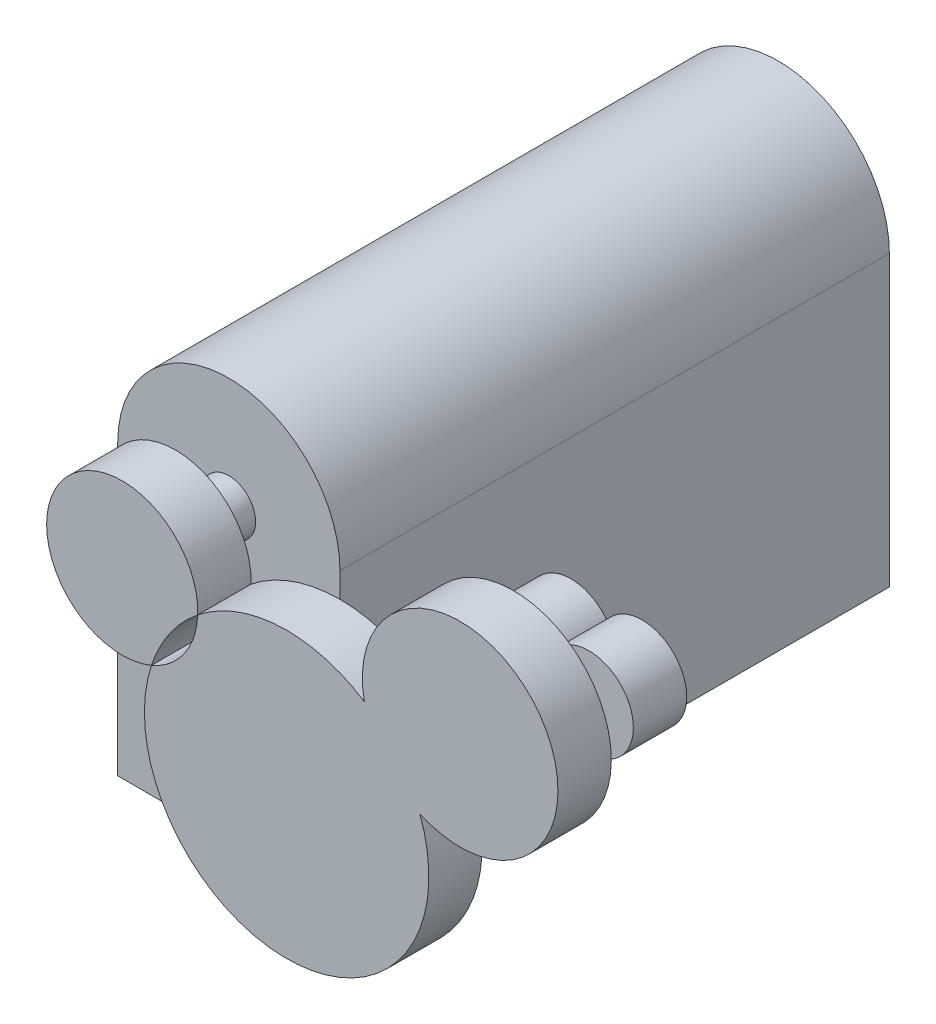
ISO-10303-21;
HEADER;
FILE_DESCRIPTION(('STEP AP214'),'2;1');
FILE_NAME('part.step','',(''),(''),'','','');
FILE_SCHEMA(('AUTOMOTIVE_DESIGN { 1 0 10303 214 1 1 1 1 }'));
ENDSEC;
DATA;
#1=APPLICATION_CONTEXT('core data for automotive mechanical design processes');
#2=APPLICATION_PROTOCOL_DEFINITION('international standard','automotive_design',2000,#1);
#3=PRODUCT_CONTEXT('',#1,'mechanical');
#4=PRODUCT('Part','Part','',(#3));
#5=PRODUCT_RELATED_PRODUCT_CATEGORY('part','',(#4));
#6=PRODUCT_DEFINITION_FORMATION('','',#4);
#7=PRODUCT_DEFINITION_CONTEXT('part definition',#1,'design');
#8=PRODUCT_DEFINITION('design','',#6,#7);
#9=PRODUCT_DEFINITION_SHAPE('','',#8);
#10=(LENGTH_UNIT() NAMED_UNIT(*) SI_UNIT(.MILLI.,.METRE.));
#11=(NAMED_UNIT(*) PLANE_ANGLE_UNIT() SI_UNIT($,.RADIAN.));
#12=(NAMED_UNIT(*) SI_UNIT($,.STERADIAN.) SOLID_ANGLE_UNIT());
#13=UNCERTAINTY_MEASURE_WITH_UNIT(LENGTH_MEASURE(1.E-05),#10,'distance_accuracy_value','');
#14=(GEOMETRIC_REPRESENTATION_CONTEXT(3) GLOBAL_UNCERTAINTY_ASSIGNED_CONTEXT((#13)) GLOBAL_UNIT_ASSIGNED_CONTEXT((#10,
#11,#12)) REPRESENTATION_CONTEXT('',''));
#15=CARTESIAN_POINT('',(0.,0.,0.));
#16=DIRECTION('',(0.,0.,1.));
#17=DIRECTION('',(1.,0.,0.));
#18=AXIS2_PLACEMENT_3D('',#15,#16,#17);
#19=CARTESIAN_POINT('',(9.25,-6.40312423743285,-8.77304960115332));
#20=DIRECTION('',(0.,0.,1.));
#21=DIRECTION('',(1.,0.,0.));
#22=AXIS2_PLACEMENT_3D('',#19,#20,#21);
#23=CYLINDRICAL_SURFACE('',#22,1.);
#24=CARTESIAN_POINT('',(9.25,-6.40312423743285,3.));
#25=DIRECTION('',(0.,0.,1.));
#26=DIRECTION('',(1.,0.,0.));
#27=AXIS2_PLACEMENT_3D('',#24,#25,#26);
#28=CIRCLE('',#27,1.);
#29=CARTESIAN_POINT('',(10.25,-6.40312423743285,3.));
#30=VERTEX_POINT('',#29);
#31=EDGE_CURVE('E100',#30,#30,#28,.F.);
#32=ORIENTED_EDGE('',*,*,#31,.T.);
#33=EDGE_LOOP('',(#32));
#34=FACE_BOUND('',#33,.T.);
#35=CARTESIAN_POINT('',(9.25,-6.40312423743285,-7.));
#36=DIRECTION('',(0.,0.,-1.));
#37=DIRECTION('',(-1.,0.,0.));
#38=AXIS2_PLACEMENT_3D('',#35,#36,#37);
#39=CIRCLE('',#38,1.);
#40=CARTESIAN_POINT('',(8.25,-6.40312423743285,-7.));
#41=VERTEX_POINT('',#40);
#42=EDGE_CURVE('E13',#41,#41,#39,.T.);
#43=ORIENTED_EDGE('',*,*,#42,.F.);
#44=EDGE_LOOP('',(#43));
#45=FACE_BOUND('',#44,.T.);
#46=ADVANCED_FACE('F92',(#34,#45),#23,.T.);
#47=CARTESIAN_POINT('',(9.25,-6.40312423743285,6.));
#48=DIRECTION('',(0.,0.,-1.));
#49=DIRECTION('',(-1.,0.,0.));
#50=AXIS2_PLACEMENT_3D('',#47,#48,#49);
#51=CYLINDRICAL_SURFACE('',#50,8.);
#52=CARTESIAN_POINT('',(9.25,-6.40312423743285,3.));
#53=DIRECTION('',(0.,0.,1.));
#54=DIRECTION('',(1.,0.,0.));
#55=AXIS2_PLACEMENT_3D('',#52,#53,#54);
#56=CIRCLE('',#55,8.);
#57=CARTESIAN_POINT('',(13.6232148532195,0.295755657563046,3.));
#58=VERTEX_POINT('',#57);
#59=CARTESIAN_POINT('',(4.24696616697173,-0.160556459220539,3.));
#60=VERTEX_POINT('',#59);
#61=EDGE_CURVE('E179',#58,#60,#56,.T.);
#62=ORIENTED_EDGE('',*,*,#61,.T.);
#63=DIRECTION('',(0.,0.,-1.));
#64=VECTOR('',#63,1.);
#65=CARTESIAN_POINT('',(4.24696616697173,-0.160556459220539,6.));
#66=LINE('',#65,#64);
#67=CARTESIAN_POINT('',(4.24696616697173,-0.160556459220539,6.));
#68=VERTEX_POINT('',#67);
#69=EDGE_CURVE('E188',#68,#60,#66,.T.);
#70=ORIENTED_EDGE('',*,*,#69,.F.);
#71=CARTESIAN_POINT('',(9.25,-6.40312423743285,6.));
#72=DIRECTION('',(0.,0.,1.));
#73=DIRECTION('',(1.,0.,0.));
#74=AXIS2_PLACEMENT_3D('',#71,#72,#73);
#75=CIRCLE('',#74,8.);
#76=CARTESIAN_POINT('',(13.6232148532195,0.295755657563046,6.));
#77=VERTEX_POINT('',#76);
#78=EDGE_CURVE('E172',#77,#68,#75,.T.);
#79=ORIENTED_EDGE('',*,*,#78,.F.);
#80=DIRECTION('',(0.,0.,-1.));
#81=VECTOR('',#80,1.);
#82=CARTESIAN_POINT('',(13.6232148532195,0.295755657563046,6.));
#83=LINE('',#82,#81);
#84=EDGE_CURVE('E184',#77,#58,#83,.T.);
#85=ORIENTED_EDGE('',*,*,#84,.T.);
#86=EDGE_LOOP('',(#62,#70,#79,#85));
#87=FACE_BOUND('',#86,.T.);
#88=ADVANCED_FACE('F206',(#87),#51,.T.);
#89=CARTESIAN_POINT('',(0.,0.,6.));
#90=DIRECTION('',(0.,0.,-1.));
#91=DIRECTION('',(-1.,0.,0.));
#92=AXIS2_PLACEMENT_3D('',#89,#90,#91);
#93=CYLINDRICAL_SURFACE('',#92,4.25);
#94=CARTESIAN_POINT('',(0.,0.,3.));
#95=DIRECTION('',(0.,0.,1.));
#96=DIRECTION('',(1.,0.,0.));
#97=AXIS2_PLACEMENT_3D('',#94,#95,#96);
#98=CIRCLE('',#97,4.25);
#99=CARTESIAN_POINT('',(1.64562642562085,-3.91847083277372,3.));
#100=VERTEX_POINT('',#99);
#101=EDGE_CURVE('E107',#100,#60,#98,.T.);
#102=ORIENTED_EDGE('',*,*,#101,.F.);
#103=DIRECTION('',(0.,0.,-1.));
#104=VECTOR('',#103,1.);
#105=CARTESIAN_POINT('',(1.64562642562085,-3.91847083277372,6.));
#106=LINE('',#105,#104);
#107=CARTESIAN_POINT('',(1.64562642562085,-3.91847083277372,6.));
#108=VERTEX_POINT('',#107);
#109=EDGE_CURVE('E185',#108,#100,#106,.T.);
#110=ORIENTED_EDGE('',*,*,#109,.F.);
#111=CARTESIAN_POINT('',(0.,0.,6.));
#112=DIRECTION('',(0.,0.,1.));
#113=DIRECTION('',(1.,0.,0.));
#114=AXIS2_PLACEMENT_3D('',#111,#112,#113);
#115=CIRCLE('',#114,4.25);
#116=EDGE_CURVE('E175',#108,#68,#115,.T.);
#117=ORIENTED_EDGE('',*,*,#116,.T.);
#118=ORIENTED_EDGE('',*,*,#69,.T.);
#119=EDGE_LOOP('',(#102,#110,#117,#118));
#120=FACE_BOUND('',#119,.T.);
#121=ADVANCED_FACE('F208',(#120),#93,.F.);
#122=CARTESIAN_POINT('',(16.744714652739,-3.60504413242873,3.));
#123=VERTEX_POINT('',#122);
#124=EDGE_CURVE('E176',#100,#123,#56,.T.);
#125=ORIENTED_EDGE('',*,*,#124,.T.);
#126=DIRECTION('',(0.,0.,-1.));
#127=VECTOR('',#126,1.);
#128=CARTESIAN_POINT('',(16.744714652739,-3.60504413242873,6.));
#129=LINE('',#128,#127);
#130=CARTESIAN_POINT('',(16.744714652739,-3.60504413242873,6.));
#131=VERTEX_POINT('',#130);
#132=EDGE_CURVE('E182',#131,#123,#129,.T.);
#133=ORIENTED_EDGE('',*,*,#132,.F.);
#134=EDGE_CURVE('E177',#108,#131,#75,.T.);
#135=ORIENTED_EDGE('',*,*,#134,.F.);
#136=ORIENTED_EDGE('',*,*,#109,.T.);
#137=EDGE_LOOP('',(#125,#133,#135,#136));
#138=FACE_BOUND('',#137,.T.);
#139=ADVANCED_FACE('F200',(#138),#51,.T.);
#140=CARTESIAN_POINT('',(0.,0.,3.));
#141=DIRECTION('',(0.,0.,1.));
#142=DIRECTION('',(1.,0.,0.));
#143=AXIS2_PLACEMENT_3D('',#140,#141,#142);
#144=PLANE('',#143);
#145=ORIENTED_EDGE('',*,*,#31,.F.);
#146=EDGE_LOOP('',(#145));
#147=FACE_BOUND('',#146,.T.);
#148=ORIENTED_EDGE('',*,*,#61,.F.);
#149=CARTESIAN_POINT('',(19.009810448979,1.40687576256716,3.));
#150=DIRECTION('',(0.,0.,1.));
#151=DIRECTION('',(1.,0.,0.));
#152=AXIS2_PLACEMENT_3D('',#149,#150,#151);
#153=CIRCLE('',#152,5.5);
#154=EDGE_CURVE('E164',#123,#58,#153,.T.);
#155=ORIENTED_EDGE('',*,*,#154,.F.);
#156=ORIENTED_EDGE('',*,*,#124,.F.);
#157=ORIENTED_EDGE('',*,*,#101,.T.);
#158=EDGE_LOOP('',(#148,#155,#156,#157));
#159=FACE_BOUND('',#158,.T.);
#160=ADVANCED_FACE('F197',(#147,#159),#144,.F.);
#161=CARTESIAN_POINT('',(0.,0.,6.));
#162=DIRECTION('',(0.,0.,1.));
#163=DIRECTION('',(1.,0.,0.));
#164=AXIS2_PLACEMENT_3D('',#161,#162,#163);
#165=PLANE('',#164);
#166=ORIENTED_EDGE('',*,*,#134,.T.);
#167=CARTESIAN_POINT('',(19.009810448979,1.40687576256716,6.));
#168=DIRECTION('',(0.,0.,1.));
#169=DIRECTION('',(1.,0.,0.));
#170=AXIS2_PLACEMENT_3D('',#167,#168,#169);
#171=CIRCLE('',#170,5.5);
#172=EDGE_CURVE('E167',#131,#77,#171,.T.);
#173=ORIENTED_EDGE('',*,*,#172,.T.);
#174=ORIENTED_EDGE('',*,*,#78,.T.);
#175=ORIENTED_EDGE('',*,*,#116,.F.);
#176=EDGE_LOOP('',(#166,#173,#174,#175));
#177=FACE_BOUND('',#176,.T.);
#178=ADVANCED_FACE('F199',(#177),#165,.T.);
#179=CARTESIAN_POINT('',(19.009810448979,1.40687576256716,6.));
#180=DIRECTION('',(0.,0.,-1.));
#181=DIRECTION('',(-1.,0.,0.));
#182=AXIS2_PLACEMENT_3D('',#179,#180,#181);
#183=CYLINDRICAL_SURFACE('',#182,5.5);
#184=ORIENTED_EDGE('',*,*,#154,.T.);
#185=ORIENTED_EDGE('',*,*,#84,.F.);
#186=ORIENTED_EDGE('',*,*,#172,.F.);
#187=ORIENTED_EDGE('',*,*,#132,.T.);
#188=EDGE_LOOP('',(#184,#185,#186,#187));
#189=FACE_BOUND('',#188,.T.);
#190=ADVANCED_FACE('F94',(#189),#183,.T.);
#191=CARTESIAN_POINT('',(13.25,-6.40312423743285,-10.));
#192=DIRECTION('',(0.,0.,1.));
#193=DIRECTION('',(1.,0.,0.));
#194=AXIS2_PLACEMENT_3D('',#191,#192,#193);
#195=CYLINDRICAL_SURFACE('',#194,2.5);
#196=CARTESIAN_POINT('',(13.25,-6.40312423743285,-7.));
#197=DIRECTION('',(0.,0.,-1.));
#198=DIRECTION('',(-1.,0.,0.));
#199=AXIS2_PLACEMENT_3D('',#196,#197,#198);
#200=CIRCLE('',#199,2.5);
#201=CARTESIAN_POINT('',(11.25,-4.90312423743285,-7.));
#202=VERTEX_POINT('',#201);
#203=CARTESIAN_POINT('',(11.25,-7.90312423743284,-7.));
#204=VERTEX_POINT('',#203);
#205=EDGE_CURVE('E163',#202,#204,#200,.T.);
#206=ORIENTED_EDGE('',*,*,#205,.T.);
#207=DIRECTION('',(0.,0.,1.));
#208=VECTOR('',#207,1.);
#209=CARTESIAN_POINT('',(11.25,-7.90312423743284,-10.));
#210=LINE('',#209,#208);
#211=CARTESIAN_POINT('',(11.25,-7.90312423743284,-10.));
#212=VERTEX_POINT('',#211);
#213=EDGE_CURVE('E149',#212,#204,#210,.T.);
#214=ORIENTED_EDGE('',*,*,#213,.F.);
#215=CARTESIAN_POINT('',(13.25,-6.40312423743285,-10.));
#216=DIRECTION('',(0.,0.,-1.));
#217=DIRECTION('',(-1.,0.,0.));
#218=AXIS2_PLACEMENT_3D('',#215,#216,#217);
#219=CIRCLE('',#218,2.5);
#220=CARTESIAN_POINT('',(11.25,-4.90312423743285,-10.));
#221=VERTEX_POINT('',#220);
#222=EDGE_CURVE('E155',#221,#212,#219,.T.);
#223=ORIENTED_EDGE('',*,*,#222,.F.);
#224=DIRECTION('',(0.,0.,1.));
#225=VECTOR('',#224,1.);
#226=CARTESIAN_POINT('',(11.25,-4.90312423743285,-10.));
#227=LINE('',#226,#225);
#228=EDGE_CURVE('E152',#221,#202,#227,.T.);
#229=ORIENTED_EDGE('',*,*,#228,.T.);
#230=EDGE_LOOP('',(#206,#214,#223,#229));
#231=FACE_BOUND('',#230,.T.);
#232=ADVANCED_FACE('F161',(#231),#195,.T.);
#233=CARTESIAN_POINT('',(9.25,-6.40312423743285,-10.));
#234=DIRECTION('',(0.,0.,1.));
#235=DIRECTION('',(1.,0.,0.));
#236=AXIS2_PLACEMENT_3D('',#233,#234,#235);
#237=CYLINDRICAL_SURFACE('',#236,2.5);
#238=CARTESIAN_POINT('',(9.25,-6.40312423743285,-7.));
#239=DIRECTION('',(0.,0.,-1.));
#240=DIRECTION('',(-1.,0.,0.));
#241=AXIS2_PLACEMENT_3D('',#238,#239,#240);
#242=CIRCLE('',#241,2.5);
#243=EDGE_CURVE('E159',#204,#202,#242,.T.);
#244=ORIENTED_EDGE('',*,*,#243,.T.);
#245=ORIENTED_EDGE('',*,*,#228,.F.);
#246=CARTESIAN_POINT('',(9.25,-6.40312423743285,-10.));
#247=DIRECTION('',(0.,0.,-1.));
#248=DIRECTION('',(-1.,0.,0.));
#249=AXIS2_PLACEMENT_3D('',#246,#247,#248);
#250=CIRCLE('',#249,2.5);
#251=EDGE_CURVE('E145',#212,#221,#250,.T.);
#252=ORIENTED_EDGE('',*,*,#251,.F.);
#253=ORIENTED_EDGE('',*,*,#213,.T.);
#254=EDGE_LOOP('',(#244,#245,#252,#253));
#255=FACE_BOUND('',#254,.T.);
#256=ADVANCED_FACE('F147',(#255),#237,.T.);
#257=CARTESIAN_POINT('',(11.25,-6.40312423743285,-10.));
#258=DIRECTION('',(0.,0.,-1.));
#259=DIRECTION('',(-1.,0.,0.));
#260=AXIS2_PLACEMENT_3D('',#257,#258,#259);
#261=PLANE('',#260);
#262=ORIENTED_EDGE('',*,*,#222,.T.);
#263=ORIENTED_EDGE('',*,*,#251,.T.);
#264=EDGE_LOOP('',(#262,#263));
#265=FACE_BOUND('',#264,.T.);
#266=ADVANCED_FACE('F157',(#265),#261,.T.);
#267=CARTESIAN_POINT('',(11.25,-6.40312423743285,-7.));
#268=DIRECTION('',(0.,0.,-1.));
#269=DIRECTION('',(-1.,0.,0.));
#270=AXIS2_PLACEMENT_3D('',#267,#268,#269);
#271=PLANE('',#270);
#272=ORIENTED_EDGE('',*,*,#42,.T.);
#273=EDGE_LOOP('',(#272));
#274=FACE_BOUND('',#273,.T.);
#275=ORIENTED_EDGE('',*,*,#205,.F.);
#276=ORIENTED_EDGE('',*,*,#243,.F.);
#277=EDGE_LOOP('',(#275,#276));
#278=FACE_BOUND('',#277,.T.);
#279=ADVANCED_FACE('F269',(#274,#278),#271,.F.);
#280=CLOSED_SHELL('',(#46,#88,#121,#139,#160,#178,#190,#232,#256,#266,#279));
#281=MANIFOLD_SOLID_BREP('B2',#280);
#282=CARTESIAN_POINT('',(0.,0.,-30.9));
#283=DIRECTION('',(0.,0.,1.));
#284=DIRECTION('',(1.,0.,0.));
#285=AXIS2_PLACEMENT_3D('',#282,#283,#284);
#286=CYLINDRICAL_SURFACE('',#285,6.25);
#287=CARTESIAN_POINT('',(0.,0.,0.));
#288=DIRECTION('',(0.,0.,1.));
#289=DIRECTION('',(1.,0.,0.));
#290=AXIS2_PLACEMENT_3D('',#287,#288,#289);
#291=CIRCLE('',#290,6.25);
#292=CARTESIAN_POINT('',(6.25,0.,0.));
#293=VERTEX_POINT('',#292);
#294=CARTESIAN_POINT('',(-6.25,0.,0.));
#295=VERTEX_POINT('',#294);
#296=EDGE_CURVE('E408',#293,#295,#291,.T.);
#297=ORIENTED_EDGE('',*,*,#296,.F.);
#298=DIRECTION('',(0.,0.,1.));
#299=VECTOR('',#298,1.);
#300=CARTESIAN_POINT('',(6.25,0.,-30.9));
#301=LINE('',#300,#299);
#302=CARTESIAN_POINT('',(6.25,0.,-30.9));
#303=VERTEX_POINT('',#302);
#304=EDGE_CURVE('E90',#303,#293,#301,.T.);
#305=ORIENTED_EDGE('',*,*,#304,.F.);
#306=CARTESIAN_POINT('',(0.,0.,-30.9));
#307=DIRECTION('',(0.,0.,1.));
#308=DIRECTION('',(1.,0.,0.));
#309=AXIS2_PLACEMENT_3D('',#306,#307,#308);
#310=CIRCLE('',#309,6.25);
#311=CARTESIAN_POINT('',(-6.25,0.,-30.9));
#312=VERTEX_POINT('',#311);
#313=EDGE_CURVE('E412',#303,#312,#310,.T.);
#314=ORIENTED_EDGE('',*,*,#313,.T.);
#315=DIRECTION('',(0.,0.,1.));
#316=VECTOR('',#315,1.);
#317=CARTESIAN_POINT('',(-6.25,0.,-30.9));
#318=LINE('',#317,#316);
#319=EDGE_CURVE('E315',#312,#295,#318,.T.);
#320=ORIENTED_EDGE('',*,*,#319,.T.);
#321=EDGE_LOOP('',(#297,#305,#314,#320));
#322=FACE_BOUND('',#321,.T.);
#323=ADVANCED_FACE('F312',(#322),#286,.T.);
#324=CARTESIAN_POINT('',(6.25,-16.25,-30.9));
#325=DIRECTION('',(1.,0.,0.));
#326=DIRECTION('',(0.,0.,-1.));
#327=AXIS2_PLACEMENT_3D('',#324,#325,#326);
#328=PLANE('',#327);
#329=DIRECTION('',(0.,1.,0.));
#330=VECTOR('',#329,1.);
#331=CARTESIAN_POINT('',(6.25,-16.25,0.));
#332=LINE('',#331,#330);
#333=CARTESIAN_POINT('',(6.25,-16.25,0.));
#334=VERTEX_POINT('',#333);
#335=EDGE_CURVE('E416',#334,#293,#332,.T.);
#336=ORIENTED_EDGE('',*,*,#335,.F.);
#337=DIRECTION('',(0.,0.,1.));
#338=VECTOR('',#337,1.);
#339=CARTESIAN_POINT('',(6.25,-16.25,-30.9));
#340=LINE('',#339,#338);
#341=CARTESIAN_POINT('',(6.25,-16.25,-30.9));
#342=VERTEX_POINT('',#341);
#343=EDGE_CURVE('E322',#342,#334,#340,.T.);
#344=ORIENTED_EDGE('',*,*,#343,.F.);
#345=DIRECTION('',(0.,1.,0.));
#346=VECTOR('',#345,1.);
#347=CARTESIAN_POINT('',(6.25,-16.25,-30.9));
#348=LINE('',#347,#346);
#349=EDGE_CURVE('E422',#342,#303,#348,.T.);
#350=ORIENTED_EDGE('',*,*,#349,.T.);
#351=ORIENTED_EDGE('',*,*,#304,.T.);
#352=EDGE_LOOP('',(#336,#344,#350,#351));
#353=FACE_BOUND('',#352,.T.);
#354=ADVANCED_FACE('F445',(#353),#328,.T.);
#355=CARTESIAN_POINT('',(-6.25,-16.25,-30.9));
#356=DIRECTION('',(0.,-1.,0.));
#357=DIRECTION('',(0.,0.,-1.));
#358=AXIS2_PLACEMENT_3D('',#355,#356,#357);
#359=PLANE('',#358);
#360=DIRECTION('',(1.,0.,0.));
#361=VECTOR('',#360,1.);
#362=CARTESIAN_POINT('',(-6.25,-16.25,0.));
#363=LINE('',#362,#361);
#364=CARTESIAN_POINT('',(-6.25,-16.25,0.));
#365=VERTEX_POINT('',#364);
#366=EDGE_CURVE('E432',#365,#334,#363,.T.);
#367=ORIENTED_EDGE('',*,*,#366,.F.);
#368=DIRECTION('',(0.,0.,1.));
#369=VECTOR('',#368,1.);
#370=CARTESIAN_POINT('',(-6.25,-16.25,-30.9));
#371=LINE('',#370,#369);
#372=CARTESIAN_POINT('',(-6.25,-16.25,-30.9));
#373=VERTEX_POINT('',#372);
#374=EDGE_CURVE('E439',#373,#365,#371,.T.);
#375=ORIENTED_EDGE('',*,*,#374,.F.);
#376=DIRECTION('',(1.,0.,0.));
#377=VECTOR('',#376,1.);
#378=CARTESIAN_POINT('',(-6.25,-16.25,-30.9));
#379=LINE('',#378,#377);
#380=EDGE_CURVE('E419',#373,#342,#379,.T.);
#381=ORIENTED_EDGE('',*,*,#380,.T.);
#382=ORIENTED_EDGE('',*,*,#343,.T.);
#383=EDGE_LOOP('',(#367,#375,#381,#382));
#384=FACE_BOUND('',#383,.T.);
#385=ADVANCED_FACE('F448',(#384),#359,.T.);
#386=CARTESIAN_POINT('',(-6.25,0.,-30.9));
#387=DIRECTION('',(-1.,0.,0.));
#388=DIRECTION('',(0.,0.,1.));
#389=AXIS2_PLACEMENT_3D('',#386,#387,#388);
#390=PLANE('',#389);
#391=DIRECTION('',(0.,-1.,0.));
#392=VECTOR('',#391,1.);
#393=CARTESIAN_POINT('',(-6.25,0.,0.));
#394=LINE('',#393,#392);
#395=EDGE_CURVE('E428',#295,#365,#394,.T.);
#396=ORIENTED_EDGE('',*,*,#395,.F.);
#397=ORIENTED_EDGE('',*,*,#319,.F.);
#398=DIRECTION('',(0.,-1.,0.));
#399=VECTOR('',#398,1.);
#400=CARTESIAN_POINT('',(-6.25,0.,-30.9));
#401=LINE('',#400,#399);
#402=EDGE_CURVE('E415',#312,#373,#401,.T.);
#403=ORIENTED_EDGE('',*,*,#402,.T.);
#404=ORIENTED_EDGE('',*,*,#374,.T.);
#405=EDGE_LOOP('',(#396,#397,#403,#404));
#406=FACE_BOUND('',#405,.T.);
#407=ADVANCED_FACE('F442',(#406),#390,.T.);
#408=CARTESIAN_POINT('',(0.,0.,-30.9));
#409=DIRECTION('',(0.,0.,1.));
#410=DIRECTION('',(1.,0.,0.));
#411=AXIS2_PLACEMENT_3D('',#408,#409,#410);
#412=PLANE('',#411);
#413=ORIENTED_EDGE('',*,*,#313,.F.);
#414=ORIENTED_EDGE('',*,*,#349,.F.);
#415=ORIENTED_EDGE('',*,*,#380,.F.);
#416=ORIENTED_EDGE('',*,*,#402,.F.);
#417=EDGE_LOOP('',(#413,#414,#415,#416));
#418=FACE_BOUND('',#417,.T.);
#419=ADVANCED_FACE('F450',(#418),#412,.F.);
#420=CARTESIAN_POINT('',(0.,0.,0.));
#421=DIRECTION('',(0.,0.,1.));
#422=DIRECTION('',(1.,0.,0.));
#423=AXIS2_PLACEMENT_3D('',#420,#421,#422);
#424=PLANE('',#423);
#425=CARTESIAN_POINT('',(0.,0.,0.));
#426=DIRECTION('',(0.,0.,1.));
#427=DIRECTION('',(1.,0.,0.));
#428=AXIS2_PLACEMENT_3D('',#425,#426,#427);
#429=CIRCLE('',#428,1.5);
#430=CARTESIAN_POINT('',(1.5,0.,0.));
#431=VERTEX_POINT('',#430);
#432=EDGE_CURVE('E392',#431,#431,#429,.T.);
#433=ORIENTED_EDGE('',*,*,#432,.F.);
#434=EDGE_LOOP('',(#433));
#435=FACE_BOUND('',#434,.T.);
#436=ORIENTED_EDGE('',*,*,#296,.T.);
#437=ORIENTED_EDGE('',*,*,#395,.T.);
#438=ORIENTED_EDGE('',*,*,#366,.T.);
#439=ORIENTED_EDGE('',*,*,#335,.T.);
#440=EDGE_LOOP('',(#436,#437,#438,#439));
#441=FACE_BOUND('',#440,.T.);
#442=ADVANCED_FACE('F444',(#435,#441),#424,.T.);
#443=CARTESIAN_POINT('',(0.,0.,3.));
#444=DIRECTION('',(0.,0.,-1.));
#445=DIRECTION('',(-1.,0.,0.));
#446=AXIS2_PLACEMENT_3D('',#443,#444,#445);
#447=CYLINDRICAL_SURFACE('',#446,1.5);
#448=CARTESIAN_POINT('',(0.,0.,3.));
#449=DIRECTION('',(0.,0.,1.));
#450=DIRECTION('',(1.,0.,0.));
#451=AXIS2_PLACEMENT_3D('',#448,#449,#450);
#452=CIRCLE('',#451,1.5);
#453=CARTESIAN_POINT('',(1.5,0.,3.));
#454=VERTEX_POINT('',#453);
#455=EDGE_CURVE('E404',#454,#454,#452,.T.);
#456=ORIENTED_EDGE('',*,*,#455,.F.);
#457=EDGE_LOOP('',(#456));
#458=FACE_BOUND('',#457,.T.);
#459=ORIENTED_EDGE('',*,*,#432,.T.);
#460=EDGE_LOOP('',(#459));
#461=FACE_BOUND('',#460,.T.);
#462=ADVANCED_FACE('F457',(#458,#461),#447,.T.);
#463=CARTESIAN_POINT('',(9.25,-6.40312423743285,6.));
#464=DIRECTION('',(0.,0.,-1.));
#465=DIRECTION('',(-1.,0.,0.));
#466=AXIS2_PLACEMENT_3D('',#463,#464,#465);
#467=CYLINDRICAL_SURFACE('',#466,8.);
#468=CARTESIAN_POINT('',(9.25,-6.40312423743285,3.));
#469=DIRECTION('',(0.,0.,1.));
#470=DIRECTION('',(1.,0.,0.));
#471=AXIS2_PLACEMENT_3D('',#468,#469,#470);
#472=CIRCLE('',#471,8.);
#473=CARTESIAN_POINT('',(4.24696616697173,-0.160556459220539,3.));
#474=VERTEX_POINT('',#473);
#475=CARTESIAN_POINT('',(1.64562642562085,-3.91847083277372,3.));
#476=VERTEX_POINT('',#475);
#477=EDGE_CURVE('E376',#474,#476,#472,.T.);
#478=ORIENTED_EDGE('',*,*,#477,.F.);
#479=DIRECTION('',(0.,0.,-1.));
#480=VECTOR('',#479,1.);
#481=CARTESIAN_POINT('',(4.24696616697173,-0.160556459220539,6.));
#482=LINE('',#481,#480);
#483=CARTESIAN_POINT('',(4.24696616697173,-0.160556459220539,6.));
#484=VERTEX_POINT('',#483);
#485=EDGE_CURVE('E386',#484,#474,#482,.T.);
#486=ORIENTED_EDGE('',*,*,#485,.F.);
#487=CARTESIAN_POINT('',(9.25,-6.40312423743285,6.));
#488=DIRECTION('',(0.,0.,1.));
#489=DIRECTION('',(1.,0.,0.));
#490=AXIS2_PLACEMENT_3D('',#487,#488,#489);
#491=CIRCLE('',#490,8.);
#492=CARTESIAN_POINT('',(1.64562642562085,-3.91847083277372,6.));
#493=VERTEX_POINT('',#492);
#494=EDGE_CURVE('E379',#484,#493,#491,.T.);
#495=ORIENTED_EDGE('',*,*,#494,.T.);
#496=DIRECTION('',(0.,0.,-1.));
#497=VECTOR('',#496,1.);
#498=CARTESIAN_POINT('',(1.64562642562085,-3.91847083277372,6.));
#499=LINE('',#498,#497);
#500=EDGE_CURVE('E373',#493,#476,#499,.T.);
#501=ORIENTED_EDGE('',*,*,#500,.T.);
#502=EDGE_LOOP('',(#478,#486,#495,#501));
#503=FACE_BOUND('',#502,.T.);
#504=ADVANCED_FACE('F375',(#503),#467,.F.);
#505=CARTESIAN_POINT('',(0.,0.,6.));
#506=DIRECTION('',(0.,0.,-1.));
#507=DIRECTION('',(-1.,0.,0.));
#508=AXIS2_PLACEMENT_3D('',#505,#506,#507);
#509=CYLINDRICAL_SURFACE('',#508,4.25);
#510=CARTESIAN_POINT('',(0.,0.,3.));
#511=DIRECTION('',(0.,0.,1.));
#512=DIRECTION('',(1.,0.,0.));
#513=AXIS2_PLACEMENT_3D('',#510,#511,#512);
#514=CIRCLE('',#513,4.25);
#515=EDGE_CURVE('E390',#474,#476,#514,.T.);
#516=ORIENTED_EDGE('',*,*,#515,.T.);
#517=ORIENTED_EDGE('',*,*,#500,.F.);
#518=CARTESIAN_POINT('',(0.,0.,6.));
#519=DIRECTION('',(0.,0.,1.));
#520=DIRECTION('',(1.,0.,0.));
#521=AXIS2_PLACEMENT_3D('',#518,#519,#520);
#522=CIRCLE('',#521,4.25);
#523=EDGE_CURVE('E385',#484,#493,#522,.T.);
#524=ORIENTED_EDGE('',*,*,#523,.F.);
#525=ORIENTED_EDGE('',*,*,#485,.T.);
#526=EDGE_LOOP('',(#516,#517,#524,#525));
#527=FACE_BOUND('',#526,.T.);
#528=ADVANCED_FACE('F394',(#527),#509,.T.);
#529=CARTESIAN_POINT('',(0.,0.,6.));
#530=DIRECTION('',(0.,0.,1.));
#531=DIRECTION('',(1.,0.,0.));
#532=AXIS2_PLACEMENT_3D('',#529,#530,#531);
#533=PLANE('',#532);
#534=ORIENTED_EDGE('',*,*,#494,.F.);
#535=ORIENTED_EDGE('',*,*,#523,.T.);
#536=EDGE_LOOP('',(#534,#535));
#537=FACE_BOUND('',#536,.T.);
#538=ADVANCED_FACE('F513',(#537),#533,.T.);
#539=CARTESIAN_POINT('',(0.,0.,3.));
#540=DIRECTION('',(0.,0.,1.));
#541=DIRECTION('',(1.,0.,0.));
#542=AXIS2_PLACEMENT_3D('',#539,#540,#541);
#543=PLANE('',#542);
#544=ORIENTED_EDGE('',*,*,#455,.T.);
#545=EDGE_LOOP('',(#544));
#546=FACE_BOUND('',#545,.T.);
#547=ORIENTED_EDGE('',*,*,#477,.T.);
#548=ORIENTED_EDGE('',*,*,#515,.F.);
#549=EDGE_LOOP('',(#547,#548));
#550=FACE_BOUND('',#549,.T.);
#551=ADVANCED_FACE('F389',(#546,#550),#543,.F.);
#552=CLOSED_SHELL('',(#323,#354,#385,#407,#419,#442,#462,#504,#528,#538,#551));
#553=MANIFOLD_SOLID_BREP('B7',#552);
#554=ADVANCED_BREP_SHAPE_REPRESENTATION('',(#18,#281,#553),#14);
#555=SHAPE_DEFINITION_REPRESENTATION(#9,#554);
ENDSEC;
END-ISO-10303-21;
